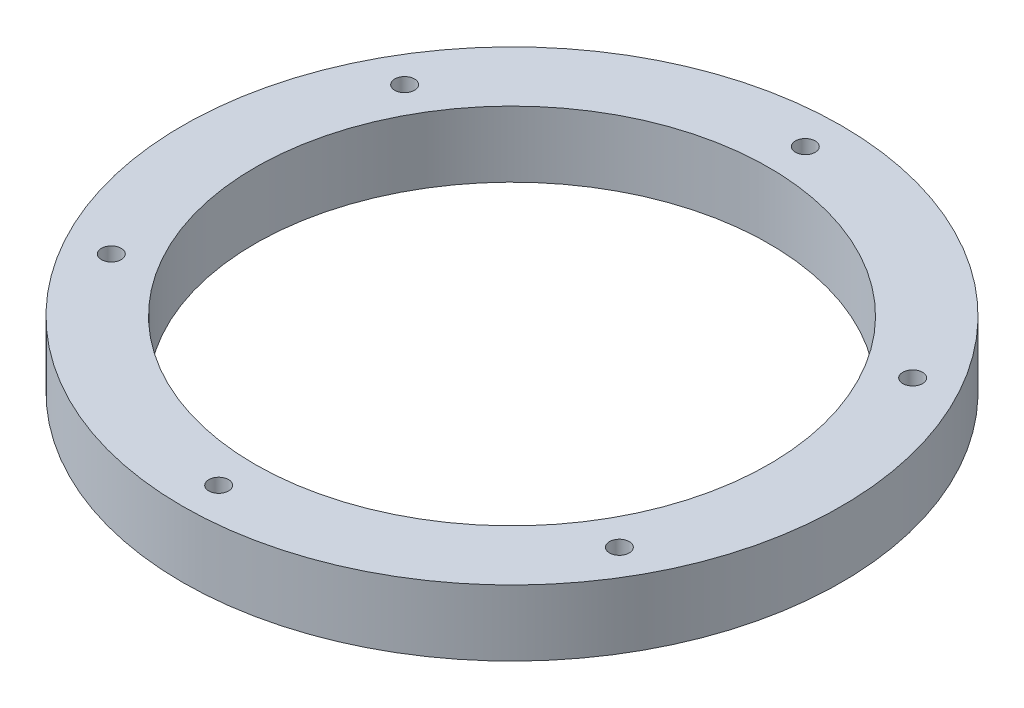
ISO-10303-21;
HEADER;
FILE_DESCRIPTION(('STEP AP214'),'2;1');
FILE_NAME('part.step','',(''),(''),'','','');
FILE_SCHEMA(('AUTOMOTIVE_DESIGN { 1 0 10303 214 1 1 1 1 }'));
ENDSEC;
DATA;
#1=APPLICATION_CONTEXT('core data for automotive mechanical design processes');
#2=APPLICATION_PROTOCOL_DEFINITION('international standard','automotive_design',2000,#1);
#3=PRODUCT_CONTEXT('',#1,'mechanical');
#4=PRODUCT('Part','Part','',(#3));
#5=PRODUCT_RELATED_PRODUCT_CATEGORY('part','',(#4));
#6=PRODUCT_DEFINITION_FORMATION('','',#4);
#7=PRODUCT_DEFINITION_CONTEXT('part definition',#1,'design');
#8=PRODUCT_DEFINITION('design','',#6,#7);
#9=PRODUCT_DEFINITION_SHAPE('','',#8);
#10=(LENGTH_UNIT() NAMED_UNIT(*) SI_UNIT(.MILLI.,.METRE.));
#11=(NAMED_UNIT(*) PLANE_ANGLE_UNIT() SI_UNIT($,.RADIAN.));
#12=(NAMED_UNIT(*) SI_UNIT($,.STERADIAN.) SOLID_ANGLE_UNIT());
#13=UNCERTAINTY_MEASURE_WITH_UNIT(LENGTH_MEASURE(1.E-05),#10,'distance_accuracy_value','');
#14=(GEOMETRIC_REPRESENTATION_CONTEXT(3) GLOBAL_UNCERTAINTY_ASSIGNED_CONTEXT((#13)) GLOBAL_UNIT_ASSIGNED_CONTEXT((#10,
#11,#12)) REPRESENTATION_CONTEXT('',''));
#15=CARTESIAN_POINT('',(0.,0.,0.));
#16=DIRECTION('',(0.,0.,1.));
#17=DIRECTION('',(1.,0.,0.));
#18=AXIS2_PLACEMENT_3D('',#15,#16,#17);
#19=CARTESIAN_POINT('',(0.,10.,0.));
#20=DIRECTION('',(0.,1.,0.));
#21=DIRECTION('',(0.,0.,1.));
#22=AXIS2_PLACEMENT_3D('',#19,#20,#21);
#23=PLANE('',#22);
#24=CARTESIAN_POINT('',(0.,10.,-44.5));
#25=DIRECTION('',(0.,1.,0.));
#26=DIRECTION('',(0.,0.,1.));
#27=AXIS2_PLACEMENT_3D('',#24,#25,#26);
#28=CIRCLE('',#27,1.5);
#29=CARTESIAN_POINT('',(0.,10.,-43.));
#30=VERTEX_POINT('',#29);
#31=EDGE_CURVE('E83',#30,#30,#28,.T.);
#32=ORIENTED_EDGE('',*,*,#31,.F.);
#33=EDGE_LOOP('',(#32));
#34=FACE_BOUND('',#33,.T.);
#35=CARTESIAN_POINT('',(-38.5381304684075,10.,-22.25));
#36=DIRECTION('',(0.,1.,0.));
#37=DIRECTION('',(0.,0.,1.));
#38=AXIS2_PLACEMENT_3D('',#35,#36,#37);
#39=CIRCLE('',#38,1.5);
#40=CARTESIAN_POINT('',(-38.5381304684075,10.,-20.75));
#41=VERTEX_POINT('',#40);
#42=EDGE_CURVE('E62',#41,#41,#39,.T.);
#43=ORIENTED_EDGE('',*,*,#42,.F.);
#44=EDGE_LOOP('',(#43));
#45=FACE_BOUND('',#44,.T.);
#46=CARTESIAN_POINT('',(-38.5381304684075,10.,22.25));
#47=DIRECTION('',(0.,1.,0.));
#48=DIRECTION('',(0.,0.,1.));
#49=AXIS2_PLACEMENT_3D('',#46,#47,#48);
#50=CIRCLE('',#49,1.5);
#51=CARTESIAN_POINT('',(-38.5381304684075,10.,23.75));
#52=VERTEX_POINT('',#51);
#53=EDGE_CURVE('E61',#52,#52,#50,.T.);
#54=ORIENTED_EDGE('',*,*,#53,.F.);
#55=EDGE_LOOP('',(#54));
#56=FACE_BOUND('',#55,.T.);
#57=CARTESIAN_POINT('',(0.,10.,44.5));
#58=DIRECTION('',(0.,1.,0.));
#59=DIRECTION('',(0.,0.,1.));
#60=AXIS2_PLACEMENT_3D('',#57,#58,#59);
#61=CIRCLE('',#60,1.5);
#62=CARTESIAN_POINT('',(0.,10.,46.));
#63=VERTEX_POINT('',#62);
#64=EDGE_CURVE('E68',#63,#63,#61,.T.);
#65=ORIENTED_EDGE('',*,*,#64,.F.);
#66=EDGE_LOOP('',(#65));
#67=FACE_BOUND('',#66,.T.);
#68=CARTESIAN_POINT('',(38.5381304684075,10.,22.25));
#69=DIRECTION('',(0.,1.,0.));
#70=DIRECTION('',(0.,0.,1.));
#71=AXIS2_PLACEMENT_3D('',#68,#69,#70);
#72=CIRCLE('',#71,1.5);
#73=CARTESIAN_POINT('',(38.5381304684075,10.,23.75));
#74=VERTEX_POINT('',#73);
#75=EDGE_CURVE('E74',#74,#74,#72,.T.);
#76=ORIENTED_EDGE('',*,*,#75,.F.);
#77=EDGE_LOOP('',(#76));
#78=FACE_BOUND('',#77,.T.);
#79=CARTESIAN_POINT('',(38.5381304684075,10.,-22.25));
#80=DIRECTION('',(0.,1.,0.));
#81=DIRECTION('',(0.,0.,1.));
#82=AXIS2_PLACEMENT_3D('',#79,#80,#81);
#83=CIRCLE('',#82,1.50000000000001);
#84=CARTESIAN_POINT('',(38.5381304684075,10.,-20.75));
#85=VERTEX_POINT('',#84);
#86=EDGE_CURVE('E80',#85,#85,#83,.T.);
#87=ORIENTED_EDGE('',*,*,#86,.F.);
#88=EDGE_LOOP('',(#87));
#89=FACE_BOUND('',#88,.T.);
#90=CARTESIAN_POINT('',(0.,10.,0.));
#91=DIRECTION('',(0.,1.,0.));
#92=DIRECTION('',(0.,0.,1.));
#93=AXIS2_PLACEMENT_3D('',#90,#91,#92);
#94=CIRCLE('',#93,50.);
#95=CARTESIAN_POINT('',(0.,10.,50.));
#96=VERTEX_POINT('',#95);
#97=EDGE_CURVE('E10',#96,#96,#94,.T.);
#98=ORIENTED_EDGE('',*,*,#97,.T.);
#99=EDGE_LOOP('',(#98));
#100=FACE_BOUND('',#99,.T.);
#101=CARTESIAN_POINT('',(0.,10.,0.));
#102=DIRECTION('',(0.,1.,0.));
#103=DIRECTION('',(0.,0.,1.));
#104=AXIS2_PLACEMENT_3D('',#101,#102,#103);
#105=CIRCLE('',#104,39.);
#106=CARTESIAN_POINT('',(0.,10.,39.));
#107=VERTEX_POINT('',#106);
#108=EDGE_CURVE('E50',#107,#107,#105,.T.);
#109=ORIENTED_EDGE('',*,*,#108,.F.);
#110=EDGE_LOOP('',(#109));
#111=FACE_BOUND('',#110,.T.);
#112=ADVANCED_FACE('F39',(#34,#45,#56,#67,#78,#89,#100,#111),#23,.T.);
#113=CARTESIAN_POINT('',(0.,0.,0.));
#114=DIRECTION('',(0.,1.,0.));
#115=DIRECTION('',(0.,0.,1.));
#116=AXIS2_PLACEMENT_3D('',#113,#114,#115);
#117=PLANE('',#116);
#118=CARTESIAN_POINT('',(0.,0.,-44.5));
#119=DIRECTION('',(0.,1.,0.));
#120=DIRECTION('',(0.,0.,1.));
#121=AXIS2_PLACEMENT_3D('',#118,#119,#120);
#122=CIRCLE('',#121,1.5);
#123=CARTESIAN_POINT('',(0.,0.,-43.));
#124=VERTEX_POINT('',#123);
#125=EDGE_CURVE('E55',#124,#124,#122,.T.);
#126=ORIENTED_EDGE('',*,*,#125,.T.);
#127=EDGE_LOOP('',(#126));
#128=FACE_BOUND('',#127,.T.);
#129=CARTESIAN_POINT('',(-38.5381304684075,0.,-22.25));
#130=DIRECTION('',(0.,1.,0.));
#131=DIRECTION('',(0.,0.,1.));
#132=AXIS2_PLACEMENT_3D('',#129,#130,#131);
#133=CIRCLE('',#132,1.5);
#134=CARTESIAN_POINT('',(-38.5381304684075,0.,-20.75));
#135=VERTEX_POINT('',#134);
#136=EDGE_CURVE('E84',#135,#135,#133,.T.);
#137=ORIENTED_EDGE('',*,*,#136,.T.);
#138=EDGE_LOOP('',(#137));
#139=FACE_BOUND('',#138,.T.);
#140=CARTESIAN_POINT('',(-38.5381304684075,0.,22.25));
#141=DIRECTION('',(0.,1.,0.));
#142=DIRECTION('',(0.,0.,1.));
#143=AXIS2_PLACEMENT_3D('',#140,#141,#142);
#144=CIRCLE('',#143,1.5);
#145=CARTESIAN_POINT('',(-38.5381304684075,0.,23.75));
#146=VERTEX_POINT('',#145);
#147=EDGE_CURVE('E58',#146,#146,#144,.T.);
#148=ORIENTED_EDGE('',*,*,#147,.T.);
#149=EDGE_LOOP('',(#148));
#150=FACE_BOUND('',#149,.T.);
#151=CARTESIAN_POINT('',(0.,0.,44.5));
#152=DIRECTION('',(0.,1.,0.));
#153=DIRECTION('',(0.,0.,1.));
#154=AXIS2_PLACEMENT_3D('',#151,#152,#153);
#155=CIRCLE('',#154,1.5);
#156=CARTESIAN_POINT('',(0.,0.,46.));
#157=VERTEX_POINT('',#156);
#158=EDGE_CURVE('E65',#157,#157,#155,.T.);
#159=ORIENTED_EDGE('',*,*,#158,.T.);
#160=EDGE_LOOP('',(#159));
#161=FACE_BOUND('',#160,.T.);
#162=CARTESIAN_POINT('',(38.5381304684075,0.,22.25));
#163=DIRECTION('',(0.,1.,0.));
#164=DIRECTION('',(0.,0.,1.));
#165=AXIS2_PLACEMENT_3D('',#162,#163,#164);
#166=CIRCLE('',#165,1.5);
#167=CARTESIAN_POINT('',(38.5381304684075,0.,23.75));
#168=VERTEX_POINT('',#167);
#169=EDGE_CURVE('E71',#168,#168,#166,.T.);
#170=ORIENTED_EDGE('',*,*,#169,.T.);
#171=EDGE_LOOP('',(#170));
#172=FACE_BOUND('',#171,.T.);
#173=CARTESIAN_POINT('',(38.5381304684075,0.,-22.25));
#174=DIRECTION('',(0.,1.,0.));
#175=DIRECTION('',(0.,0.,1.));
#176=AXIS2_PLACEMENT_3D('',#173,#174,#175);
#177=CIRCLE('',#176,1.50000000000001);
#178=CARTESIAN_POINT('',(38.5381304684075,0.,-20.75));
#179=VERTEX_POINT('',#178);
#180=EDGE_CURVE('E77',#179,#179,#177,.T.);
#181=ORIENTED_EDGE('',*,*,#180,.T.);
#182=EDGE_LOOP('',(#181));
#183=FACE_BOUND('',#182,.T.);
#184=CARTESIAN_POINT('',(0.,0.,0.));
#185=DIRECTION('',(0.,1.,0.));
#186=DIRECTION('',(0.,0.,1.));
#187=AXIS2_PLACEMENT_3D('',#184,#185,#186);
#188=CIRCLE('',#187,50.);
#189=CARTESIAN_POINT('',(0.,0.,50.));
#190=VERTEX_POINT('',#189);
#191=EDGE_CURVE('E43',#190,#190,#188,.T.);
#192=ORIENTED_EDGE('',*,*,#191,.F.);
#193=EDGE_LOOP('',(#192));
#194=FACE_BOUND('',#193,.T.);
#195=CARTESIAN_POINT('',(0.,0.,0.));
#196=DIRECTION('',(0.,1.,0.));
#197=DIRECTION('',(0.,0.,1.));
#198=AXIS2_PLACEMENT_3D('',#195,#196,#197);
#199=CIRCLE('',#198,39.);
#200=CARTESIAN_POINT('',(0.,0.,39.));
#201=VERTEX_POINT('',#200);
#202=EDGE_CURVE('E52',#201,#201,#199,.T.);
#203=ORIENTED_EDGE('',*,*,#202,.T.);
#204=EDGE_LOOP('',(#203));
#205=FACE_BOUND('',#204,.T.);
#206=ADVANCED_FACE('F94',(#128,#139,#150,#161,#172,#183,#194,#205),#117,.F.);
#207=CARTESIAN_POINT('',(0.,10.,0.));
#208=DIRECTION('',(0.,-1.,0.));
#209=DIRECTION('',(0.,0.,-1.));
#210=AXIS2_PLACEMENT_3D('',#207,#208,#209);
#211=CYLINDRICAL_SURFACE('',#210,50.);
#212=ORIENTED_EDGE('',*,*,#97,.F.);
#213=EDGE_LOOP('',(#212));
#214=FACE_BOUND('',#213,.T.);
#215=ORIENTED_EDGE('',*,*,#191,.T.);
#216=EDGE_LOOP('',(#215));
#217=FACE_BOUND('',#216,.T.);
#218=ADVANCED_FACE('F41',(#214,#217),#211,.T.);
#219=CARTESIAN_POINT('',(0.,10.,0.));
#220=DIRECTION('',(0.,-1.,0.));
#221=DIRECTION('',(0.,0.,-1.));
#222=AXIS2_PLACEMENT_3D('',#219,#220,#221);
#223=CYLINDRICAL_SURFACE('',#222,39.);
#224=ORIENTED_EDGE('',*,*,#108,.T.);
#225=EDGE_LOOP('',(#224));
#226=FACE_BOUND('',#225,.T.);
#227=ORIENTED_EDGE('',*,*,#202,.F.);
#228=EDGE_LOOP('',(#227));
#229=FACE_BOUND('',#228,.T.);
#230=ADVANCED_FACE('F119',(#226,#229),#223,.F.);
#231=CARTESIAN_POINT('',(38.5381304684075,0.,-22.25));
#232=DIRECTION('',(0.,1.,0.));
#233=DIRECTION('',(0.,0.,1.));
#234=AXIS2_PLACEMENT_3D('',#231,#232,#233);
#235=CYLINDRICAL_SURFACE('',#234,1.50000000000001);
#236=ORIENTED_EDGE('',*,*,#180,.F.);
#237=EDGE_LOOP('',(#236));
#238=FACE_BOUND('',#237,.T.);
#239=ORIENTED_EDGE('',*,*,#86,.T.);
#240=EDGE_LOOP('',(#239));
#241=FACE_BOUND('',#240,.T.);
#242=ADVANCED_FACE('F122',(#238,#241),#235,.F.);
#243=CARTESIAN_POINT('',(38.5381304684075,0.,22.25));
#244=DIRECTION('',(0.,1.,0.));
#245=DIRECTION('',(0.,0.,1.));
#246=AXIS2_PLACEMENT_3D('',#243,#244,#245);
#247=CYLINDRICAL_SURFACE('',#246,1.5);
#248=ORIENTED_EDGE('',*,*,#169,.F.);
#249=EDGE_LOOP('',(#248));
#250=FACE_BOUND('',#249,.T.);
#251=ORIENTED_EDGE('',*,*,#75,.T.);
#252=EDGE_LOOP('',(#251));
#253=FACE_BOUND('',#252,.T.);
#254=ADVANCED_FACE('F140',(#250,#253),#247,.F.);
#255=CARTESIAN_POINT('',(0.,0.,44.5));
#256=DIRECTION('',(0.,1.,0.));
#257=DIRECTION('',(0.,0.,1.));
#258=AXIS2_PLACEMENT_3D('',#255,#256,#257);
#259=CYLINDRICAL_SURFACE('',#258,1.5);
#260=ORIENTED_EDGE('',*,*,#158,.F.);
#261=EDGE_LOOP('',(#260));
#262=FACE_BOUND('',#261,.T.);
#263=ORIENTED_EDGE('',*,*,#64,.T.);
#264=EDGE_LOOP('',(#263));
#265=FACE_BOUND('',#264,.T.);
#266=ADVANCED_FACE('F136',(#262,#265),#259,.F.);
#267=CARTESIAN_POINT('',(-38.5381304684075,0.,22.25));
#268=DIRECTION('',(0.,1.,0.));
#269=DIRECTION('',(0.,0.,1.));
#270=AXIS2_PLACEMENT_3D('',#267,#268,#269);
#271=CYLINDRICAL_SURFACE('',#270,1.5);
#272=ORIENTED_EDGE('',*,*,#147,.F.);
#273=EDGE_LOOP('',(#272));
#274=FACE_BOUND('',#273,.T.);
#275=ORIENTED_EDGE('',*,*,#53,.T.);
#276=EDGE_LOOP('',(#275));
#277=FACE_BOUND('',#276,.T.);
#278=ADVANCED_FACE('F133',(#274,#277),#271,.F.);
#279=CARTESIAN_POINT('',(-38.5381304684075,0.,-22.25));
#280=DIRECTION('',(0.,1.,0.));
#281=DIRECTION('',(0.,0.,1.));
#282=AXIS2_PLACEMENT_3D('',#279,#280,#281);
#283=CYLINDRICAL_SURFACE('',#282,1.5);
#284=ORIENTED_EDGE('',*,*,#136,.F.);
#285=EDGE_LOOP('',(#284));
#286=FACE_BOUND('',#285,.T.);
#287=ORIENTED_EDGE('',*,*,#42,.T.);
#288=EDGE_LOOP('',(#287));
#289=FACE_BOUND('',#288,.T.);
#290=ADVANCED_FACE('F100',(#286,#289),#283,.F.);
#291=CARTESIAN_POINT('',(0.,0.,-44.5));
#292=DIRECTION('',(0.,1.,0.));
#293=DIRECTION('',(0.,0.,1.));
#294=AXIS2_PLACEMENT_3D('',#291,#292,#293);
#295=CYLINDRICAL_SURFACE('',#294,1.5);
#296=ORIENTED_EDGE('',*,*,#125,.F.);
#297=EDGE_LOOP('',(#296));
#298=FACE_BOUND('',#297,.T.);
#299=ORIENTED_EDGE('',*,*,#31,.T.);
#300=EDGE_LOOP('',(#299));
#301=FACE_BOUND('',#300,.T.);
#302=ADVANCED_FACE('F97',(#298,#301),#295,.F.);
#303=CLOSED_SHELL('',(#112,#206,#218,#230,#242,#254,#266,#278,#290,#302));
#304=MANIFOLD_SOLID_BREP('B2',#303);
#305=ADVANCED_BREP_SHAPE_REPRESENTATION('',(#18,#304),#14);
#306=SHAPE_DEFINITION_REPRESENTATION(#9,#305);
ENDSEC;
END-ISO-10303-21;
